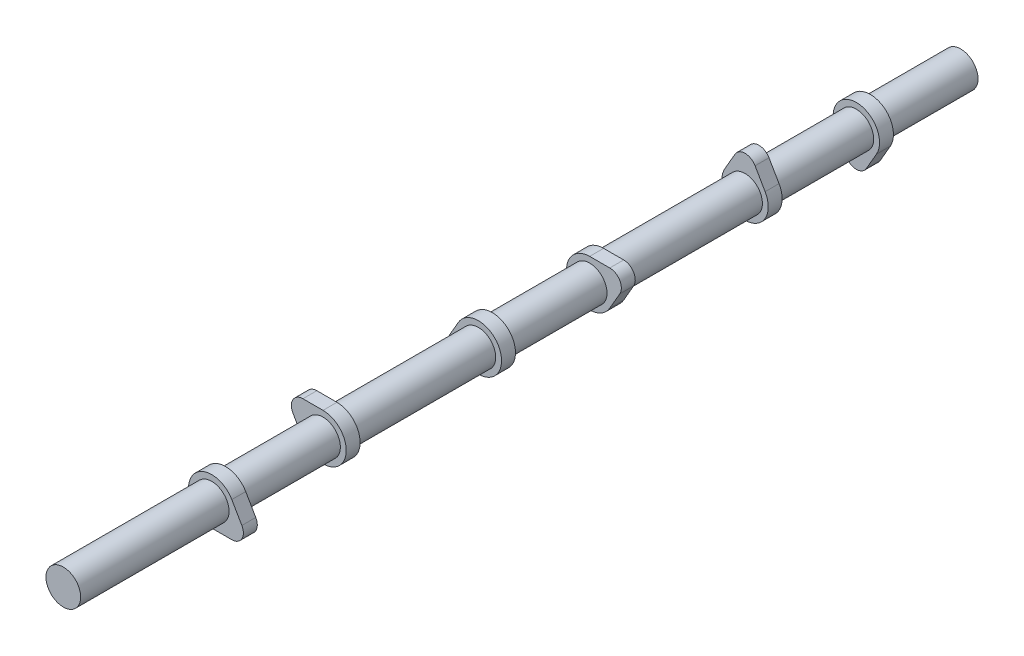
ISO-10303-21;
HEADER;
FILE_DESCRIPTION(('STEP AP214'),'2;1');
FILE_NAME('part.step','',(''),(''),'','','');
FILE_SCHEMA(('AUTOMOTIVE_DESIGN { 1 0 10303 214 1 1 1 1 }'));
ENDSEC;
DATA;
#1=APPLICATION_CONTEXT('core data for automotive mechanical design processes');
#2=APPLICATION_PROTOCOL_DEFINITION('international standard','automotive_design',2000,#1);
#3=PRODUCT_CONTEXT('',#1,'mechanical');
#4=PRODUCT('Part','Part','',(#3));
#5=PRODUCT_RELATED_PRODUCT_CATEGORY('part','',(#4));
#6=PRODUCT_DEFINITION_FORMATION('','',#4);
#7=PRODUCT_DEFINITION_CONTEXT('part definition',#1,'design');
#8=PRODUCT_DEFINITION('design','',#6,#7);
#9=PRODUCT_DEFINITION_SHAPE('','',#8);
#10=(LENGTH_UNIT() NAMED_UNIT(*) SI_UNIT(.MILLI.,.METRE.));
#11=(NAMED_UNIT(*) PLANE_ANGLE_UNIT() SI_UNIT($,.RADIAN.));
#12=(NAMED_UNIT(*) SI_UNIT($,.STERADIAN.) SOLID_ANGLE_UNIT());
#13=UNCERTAINTY_MEASURE_WITH_UNIT(LENGTH_MEASURE(1.E-05),#10,'distance_accuracy_value','');
#14=(GEOMETRIC_REPRESENTATION_CONTEXT(3) GLOBAL_UNCERTAINTY_ASSIGNED_CONTEXT((#13)) GLOBAL_UNIT_ASSIGNED_CONTEXT((#10,
#11,#12)) REPRESENTATION_CONTEXT('',''));
#15=CARTESIAN_POINT('',(0.,0.,0.));
#16=DIRECTION('',(0.,0.,1.));
#17=DIRECTION('',(1.,0.,0.));
#18=AXIS2_PLACEMENT_3D('',#15,#16,#17);
#19=CARTESIAN_POINT('',(0.,12.7,64.77));
#20=DIRECTION('',(0.,0.,-1.));
#21=DIRECTION('',(-1.,0.,0.));
#22=AXIS2_PLACEMENT_3D('',#19,#20,#21);
#23=CYLINDRICAL_SURFACE('',#22,6.35);
#24=CARTESIAN_POINT('',(0.,12.7,57.15));
#25=DIRECTION('',(0.,0.,1.));
#26=DIRECTION('',(1.,0.,0.));
#27=AXIS2_PLACEMENT_3D('',#24,#25,#26);
#28=CIRCLE('',#27,6.35);
#29=CARTESIAN_POINT('',(5.49926131403118,15.875,57.15));
#30=VERTEX_POINT('',#29);
#31=CARTESIAN_POINT('',(-5.49926131403118,15.875,57.15));
#32=VERTEX_POINT('',#31);
#33=EDGE_CURVE('E456',#30,#32,#28,.T.);
#34=ORIENTED_EDGE('',*,*,#33,.T.);
#35=DIRECTION('',(0.,0.,-1.));
#36=VECTOR('',#35,1.);
#37=CARTESIAN_POINT('',(-5.49926131403118,15.875,64.77));
#38=LINE('',#37,#36);
#39=CARTESIAN_POINT('',(-5.49926131403118,15.875,64.77));
#40=VERTEX_POINT('',#39);
#41=EDGE_CURVE('E486',#40,#32,#38,.T.);
#42=ORIENTED_EDGE('',*,*,#41,.F.);
#43=CARTESIAN_POINT('',(0.,12.7,64.77));
#44=DIRECTION('',(0.,0.,1.));
#45=DIRECTION('',(1.,0.,0.));
#46=AXIS2_PLACEMENT_3D('',#43,#44,#45);
#47=CIRCLE('',#46,6.35);
#48=CARTESIAN_POINT('',(5.49926131403118,15.875,64.77));
#49=VERTEX_POINT('',#48);
#50=EDGE_CURVE('E457',#49,#40,#47,.T.);
#51=ORIENTED_EDGE('',*,*,#50,.F.);
#52=DIRECTION('',(0.,0.,-1.));
#53=VECTOR('',#52,1.);
#54=CARTESIAN_POINT('',(5.49926131403118,15.875,64.77));
#55=LINE('',#54,#53);
#56=EDGE_CURVE('E467',#49,#30,#55,.T.);
#57=ORIENTED_EDGE('',*,*,#56,.T.);
#58=EDGE_LOOP('',(#34,#42,#51,#57));
#59=FACE_BOUND('',#58,.T.);
#60=ADVANCED_FACE('F41',(#59),#23,.T.);
#61=CARTESIAN_POINT('',(-5.49926131403118,15.875,64.77));
#62=DIRECTION('',(0.866025403784439,-0.5,0.));
#63=DIRECTION('',(0.5,0.866025403784439,0.));
#64=AXIS2_PLACEMENT_3D('',#61,#62,#63);
#65=PLANE('',#64);
#66=DIRECTION('',(-0.5,-0.866025403784439,0.));
#67=VECTOR('',#66,1.);
#68=CARTESIAN_POINT('',(-5.49926131403118,15.875,57.15));
#69=LINE('',#68,#67);
#70=CARTESIAN_POINT('',(-10.9985226280624,6.35,57.15));
#71=VERTEX_POINT('',#70);
#72=EDGE_CURVE('E471',#32,#71,#69,.T.);
#73=ORIENTED_EDGE('',*,*,#72,.T.);
#74=DIRECTION('',(0.,0.,-1.));
#75=VECTOR('',#74,1.);
#76=CARTESIAN_POINT('',(-10.9985226280624,6.35,64.77));
#77=LINE('',#76,#75);
#78=CARTESIAN_POINT('',(-10.9985226280624,6.35,64.77));
#79=VERTEX_POINT('',#78);
#80=EDGE_CURVE('E483',#79,#71,#77,.T.);
#81=ORIENTED_EDGE('',*,*,#80,.F.);
#82=DIRECTION('',(-0.5,-0.866025403784439,0.));
#83=VECTOR('',#82,1.);
#84=CARTESIAN_POINT('',(-5.49926131403118,15.875,64.77));
#85=LINE('',#84,#83);
#86=EDGE_CURVE('E91',#40,#79,#85,.T.);
#87=ORIENTED_EDGE('',*,*,#86,.F.);
#88=ORIENTED_EDGE('',*,*,#41,.T.);
#89=EDGE_LOOP('',(#73,#81,#87,#88));
#90=FACE_BOUND('',#89,.T.);
#91=ADVANCED_FACE('F507',(#90),#65,.F.);
#92=CARTESIAN_POINT('',(0.,0.,64.77));
#93=DIRECTION('',(0.,0.,-1.));
#94=DIRECTION('',(-1.,0.,0.));
#95=AXIS2_PLACEMENT_3D('',#92,#93,#94);
#96=CYLINDRICAL_SURFACE('',#95,12.7);
#97=CARTESIAN_POINT('',(0.,0.,57.15));
#98=DIRECTION('',(0.,0.,1.));
#99=DIRECTION('',(1.,0.,0.));
#100=AXIS2_PLACEMENT_3D('',#97,#98,#99);
#101=CIRCLE('',#100,12.7);
#102=CARTESIAN_POINT('',(10.9985226280624,6.35,57.15));
#103=VERTEX_POINT('',#102);
#104=EDGE_CURVE('E77',#71,#103,#101,.T.);
#105=ORIENTED_EDGE('',*,*,#104,.T.);
#106=DIRECTION('',(0.,0.,-1.));
#107=VECTOR('',#106,1.);
#108=CARTESIAN_POINT('',(10.9985226280624,6.35,64.77));
#109=LINE('',#108,#107);
#110=CARTESIAN_POINT('',(10.9985226280624,6.35,64.77));
#111=VERTEX_POINT('',#110);
#112=EDGE_CURVE('E480',#111,#103,#109,.T.);
#113=ORIENTED_EDGE('',*,*,#112,.F.);
#114=CARTESIAN_POINT('',(0.,0.,64.77));
#115=DIRECTION('',(0.,0.,1.));
#116=DIRECTION('',(1.,0.,0.));
#117=AXIS2_PLACEMENT_3D('',#114,#115,#116);
#118=CIRCLE('',#117,12.7);
#119=EDGE_CURVE('E462',#79,#111,#118,.T.);
#120=ORIENTED_EDGE('',*,*,#119,.F.);
#121=ORIENTED_EDGE('',*,*,#80,.T.);
#122=EDGE_LOOP('',(#105,#113,#120,#121));
#123=FACE_BOUND('',#122,.T.);
#124=ADVANCED_FACE('F506',(#123),#96,.T.);
#125=CARTESIAN_POINT('',(5.49926131403118,15.875,64.77));
#126=DIRECTION('',(-0.866025403784438,-0.5,0.));
#127=DIRECTION('',(0.5,-0.866025403784439,0.));
#128=AXIS2_PLACEMENT_3D('',#125,#126,#127);
#129=PLANE('',#128);
#130=DIRECTION('',(-0.5,0.866025403784439,0.));
#131=VECTOR('',#130,1.);
#132=CARTESIAN_POINT('',(5.49926131403118,15.875,57.15));
#133=LINE('',#132,#131);
#134=EDGE_CURVE('E83',#103,#30,#133,.T.);
#135=ORIENTED_EDGE('',*,*,#134,.T.);
#136=ORIENTED_EDGE('',*,*,#56,.F.);
#137=DIRECTION('',(-0.5,0.866025403784439,0.));
#138=VECTOR('',#137,1.);
#139=CARTESIAN_POINT('',(5.49926131403118,15.875,64.77));
#140=LINE('',#139,#138);
#141=EDGE_CURVE('E59',#111,#49,#140,.T.);
#142=ORIENTED_EDGE('',*,*,#141,.F.);
#143=ORIENTED_EDGE('',*,*,#112,.T.);
#144=EDGE_LOOP('',(#135,#136,#142,#143));
#145=FACE_BOUND('',#144,.T.);
#146=ADVANCED_FACE('F504',(#145),#129,.F.);
#147=CARTESIAN_POINT('',(0.,12.7,64.77));
#148=DIRECTION('',(0.,0.,1.));
#149=DIRECTION('',(1.,0.,0.));
#150=AXIS2_PLACEMENT_3D('',#147,#148,#149);
#151=PLANE('',#150);
#152=CARTESIAN_POINT('',(0.,0.,64.77));
#153=DIRECTION('',(0.,0.,1.));
#154=DIRECTION('',(1.,0.,0.));
#155=AXIS2_PLACEMENT_3D('',#152,#153,#154);
#156=CIRCLE('',#155,9.5);
#157=CARTESIAN_POINT('',(9.5,0.,64.77));
#158=VERTEX_POINT('',#157);
#159=EDGE_CURVE('E452',#158,#158,#156,.F.);
#160=ORIENTED_EDGE('',*,*,#159,.T.);
#161=EDGE_LOOP('',(#160));
#162=FACE_BOUND('',#161,.T.);
#163=ORIENTED_EDGE('',*,*,#50,.T.);
#164=ORIENTED_EDGE('',*,*,#86,.T.);
#165=ORIENTED_EDGE('',*,*,#119,.T.);
#166=ORIENTED_EDGE('',*,*,#141,.T.);
#167=EDGE_LOOP('',(#163,#164,#165,#166));
#168=FACE_BOUND('',#167,.T.);
#169=ADVANCED_FACE('F498',(#162,#168),#151,.T.);
#170=CARTESIAN_POINT('',(0.,12.7,57.15));
#171=DIRECTION('',(0.,0.,1.));
#172=DIRECTION('',(1.,0.,0.));
#173=AXIS2_PLACEMENT_3D('',#170,#171,#172);
#174=PLANE('',#173);
#175=CARTESIAN_POINT('',(0.,0.,57.15));
#176=DIRECTION('',(0.,0.,1.));
#177=DIRECTION('',(1.,0.,0.));
#178=AXIS2_PLACEMENT_3D('',#175,#176,#177);
#179=CIRCLE('',#178,9.5);
#180=CARTESIAN_POINT('',(9.5,0.,57.15));
#181=VERTEX_POINT('',#180);
#182=EDGE_CURVE('E51',#181,#181,#179,.F.);
#183=ORIENTED_EDGE('',*,*,#182,.F.);
#184=EDGE_LOOP('',(#183));
#185=FACE_BOUND('',#184,.T.);
#186=ORIENTED_EDGE('',*,*,#33,.F.);
#187=ORIENTED_EDGE('',*,*,#134,.F.);
#188=ORIENTED_EDGE('',*,*,#104,.F.);
#189=ORIENTED_EDGE('',*,*,#72,.F.);
#190=EDGE_LOOP('',(#186,#187,#188,#189));
#191=FACE_BOUND('',#190,.T.);
#192=ADVANCED_FACE('F495',(#185,#191),#174,.F.);
#193=CARTESIAN_POINT('',(0.,0.,120.65));
#194=DIRECTION('',(0.,0.,-1.));
#195=DIRECTION('',(-1.,0.,0.));
#196=AXIS2_PLACEMENT_3D('',#193,#194,#195);
#197=CYLINDRICAL_SURFACE('',#196,9.5);
#198=CARTESIAN_POINT('',(0.,0.,3.80999999999999));
#199=DIRECTION('',(0.,0.,1.));
#200=DIRECTION('',(1.,0.,0.));
#201=AXIS2_PLACEMENT_3D('',#198,#199,#200);
#202=CIRCLE('',#201,9.5);
#203=CARTESIAN_POINT('',(9.5,0.,3.80999999999999));
#204=VERTEX_POINT('',#203);
#205=EDGE_CURVE('E44',#204,#204,#202,.T.);
#206=ORIENTED_EDGE('',*,*,#205,.T.);
#207=EDGE_LOOP('',(#206));
#208=FACE_BOUND('',#207,.T.);
#209=ORIENTED_EDGE('',*,*,#182,.T.);
#210=EDGE_LOOP('',(#209));
#211=FACE_BOUND('',#210,.T.);
#212=ADVANCED_FACE('F493',(#208,#211),#197,.T.);
#213=ORIENTED_EDGE('',*,*,#159,.F.);
#214=EDGE_LOOP('',(#213));
#215=FACE_BOUND('',#214,.T.);
#216=CARTESIAN_POINT('',(0.,0.,142.24));
#217=DIRECTION('',(0.,0.,1.));
#218=DIRECTION('',(-0.500000000000004,0.866025403784436,0.));
#219=AXIS2_PLACEMENT_3D('',#216,#217,#218);
#220=CIRCLE('',#219,9.5);
#221=CARTESIAN_POINT('',(-4.75000000000004,8.22724133595215,142.24));
#222=VERTEX_POINT('',#221);
#223=EDGE_CURVE('E399',#222,#222,#220,.T.);
#224=ORIENTED_EDGE('',*,*,#223,.F.);
#225=EDGE_LOOP('',(#224));
#226=FACE_BOUND('',#225,.T.);
#227=ADVANCED_FACE('F520',(#215,#226),#197,.T.);
#228=CARTESIAN_POINT('',(0.,-12.7,3.81));
#229=DIRECTION('',(0.,0.,-1.));
#230=DIRECTION('',(1.,0.,0.));
#231=AXIS2_PLACEMENT_3D('',#228,#229,#230);
#232=CYLINDRICAL_SURFACE('',#231,6.35);
#233=CARTESIAN_POINT('',(0.,-12.7,-3.81));
#234=DIRECTION('',(0.,0.,1.));
#235=DIRECTION('',(-1.,0.,0.));
#236=AXIS2_PLACEMENT_3D('',#233,#234,#235);
#237=CIRCLE('',#236,6.35);
#238=CARTESIAN_POINT('',(-5.49926131403129,-15.875,-3.81));
#239=VERTEX_POINT('',#238);
#240=CARTESIAN_POINT('',(5.49926131403107,-15.875,-3.81));
#241=VERTEX_POINT('',#240);
#242=EDGE_CURVE('E410',#239,#241,#237,.T.);
#243=ORIENTED_EDGE('',*,*,#242,.T.);
#244=DIRECTION('',(0.,0.,-1.));
#245=VECTOR('',#244,1.);
#246=CARTESIAN_POINT('',(5.49926131403107,-15.875,3.81));
#247=LINE('',#246,#245);
#248=CARTESIAN_POINT('',(5.49926131403107,-15.875,3.81));
#249=VERTEX_POINT('',#248);
#250=EDGE_CURVE('E448',#249,#241,#247,.T.);
#251=ORIENTED_EDGE('',*,*,#250,.F.);
#252=CARTESIAN_POINT('',(0.,-12.7,3.81));
#253=DIRECTION('',(0.,0.,1.));
#254=DIRECTION('',(-1.,0.,0.));
#255=AXIS2_PLACEMENT_3D('',#252,#253,#254);
#256=CIRCLE('',#255,6.35);
#257=CARTESIAN_POINT('',(-5.49926131403129,-15.875,3.81));
#258=VERTEX_POINT('',#257);
#259=EDGE_CURVE('E411',#258,#249,#256,.T.);
#260=ORIENTED_EDGE('',*,*,#259,.F.);
#261=DIRECTION('',(0.,0.,-1.));
#262=VECTOR('',#261,1.);
#263=CARTESIAN_POINT('',(-5.49926131403129,-15.875,3.81));
#264=LINE('',#263,#262);
#265=EDGE_CURVE('E425',#258,#239,#264,.T.);
#266=ORIENTED_EDGE('',*,*,#265,.T.);
#267=EDGE_LOOP('',(#243,#251,#260,#266));
#268=FACE_BOUND('',#267,.T.);
#269=ADVANCED_FACE('F523',(#268),#232,.T.);
#270=CARTESIAN_POINT('',(5.49926131403107,-15.875,3.81));
#271=DIRECTION('',(-0.866025403784435,0.500000000000006,0.));
#272=DIRECTION('',(-0.500000000000006,-0.866025403784435,0.));
#273=AXIS2_PLACEMENT_3D('',#270,#271,#272);
#274=PLANE('',#273);
#275=DIRECTION('',(0.500000000000006,0.866025403784435,0.));
#276=VECTOR('',#275,1.);
#277=CARTESIAN_POINT('',(5.49926131403107,-15.875,-3.81));
#278=LINE('',#277,#276);
#279=CARTESIAN_POINT('',(10.9985226280623,-6.35000000000008,-3.81));
#280=VERTEX_POINT('',#279);
#281=EDGE_CURVE('E429',#241,#280,#278,.T.);
#282=ORIENTED_EDGE('',*,*,#281,.T.);
#283=DIRECTION('',(0.,0.,-1.));
#284=VECTOR('',#283,1.);
#285=CARTESIAN_POINT('',(10.9985226280623,-6.35000000000008,3.81));
#286=LINE('',#285,#284);
#287=CARTESIAN_POINT('',(10.9985226280623,-6.35000000000008,3.81));
#288=VERTEX_POINT('',#287);
#289=EDGE_CURVE('E444',#288,#280,#286,.T.);
#290=ORIENTED_EDGE('',*,*,#289,.F.);
#291=DIRECTION('',(0.500000000000006,0.866025403784435,0.));
#292=VECTOR('',#291,1.);
#293=CARTESIAN_POINT('',(5.49926131403107,-15.875,3.81));
#294=LINE('',#293,#292);
#295=EDGE_CURVE('E415',#249,#288,#294,.T.);
#296=ORIENTED_EDGE('',*,*,#295,.F.);
#297=ORIENTED_EDGE('',*,*,#250,.T.);
#298=EDGE_LOOP('',(#282,#290,#296,#297));
#299=FACE_BOUND('',#298,.T.);
#300=ADVANCED_FACE('F528',(#299),#274,.F.);
#301=CARTESIAN_POINT('',(0.,0.,3.81));
#302=DIRECTION('',(0.,0.,-1.));
#303=DIRECTION('',(1.,0.,0.));
#304=AXIS2_PLACEMENT_3D('',#301,#302,#303);
#305=CYLINDRICAL_SURFACE('',#304,12.7);
#306=CARTESIAN_POINT('',(0.,0.,-3.81));
#307=DIRECTION('',(0.,0.,1.));
#308=DIRECTION('',(-1.,0.,0.));
#309=AXIS2_PLACEMENT_3D('',#306,#307,#308);
#310=CIRCLE('',#309,12.7);
#311=CARTESIAN_POINT('',(-10.9985226280624,-6.34999999999993,-3.81));
#312=VERTEX_POINT('',#311);
#313=EDGE_CURVE('E432',#280,#312,#310,.T.);
#314=ORIENTED_EDGE('',*,*,#313,.T.);
#315=DIRECTION('',(0.,0.,-1.));
#316=VECTOR('',#315,1.);
#317=CARTESIAN_POINT('',(-10.9985226280624,-6.34999999999993,3.81));
#318=LINE('',#317,#316);
#319=CARTESIAN_POINT('',(-10.9985226280624,-6.34999999999993,3.81));
#320=VERTEX_POINT('',#319);
#321=EDGE_CURVE('E440',#320,#312,#318,.T.);
#322=ORIENTED_EDGE('',*,*,#321,.F.);
#323=CARTESIAN_POINT('',(0.,0.,3.81));
#324=DIRECTION('',(0.,0.,1.));
#325=DIRECTION('',(-1.,0.,0.));
#326=AXIS2_PLACEMENT_3D('',#323,#324,#325);
#327=CIRCLE('',#326,12.7);
#328=EDGE_CURVE('E419',#288,#320,#327,.T.);
#329=ORIENTED_EDGE('',*,*,#328,.F.);
#330=ORIENTED_EDGE('',*,*,#289,.T.);
#331=EDGE_LOOP('',(#314,#322,#329,#330));
#332=FACE_BOUND('',#331,.T.);
#333=ADVANCED_FACE('F532',(#332),#305,.T.);
#334=CARTESIAN_POINT('',(-5.49926131403129,-15.875,3.81));
#335=DIRECTION('',(0.866025403784442,0.499999999999994,0.));
#336=DIRECTION('',(-0.499999999999994,0.866025403784442,0.));
#337=AXIS2_PLACEMENT_3D('',#334,#335,#336);
#338=PLANE('',#337);
#339=DIRECTION('',(0.499999999999994,-0.866025403784442,0.));
#340=VECTOR('',#339,1.);
#341=CARTESIAN_POINT('',(-5.49926131403129,-15.875,-3.81));
#342=LINE('',#341,#340);
#343=EDGE_CURVE('E416',#312,#239,#342,.T.);
#344=ORIENTED_EDGE('',*,*,#343,.T.);
#345=ORIENTED_EDGE('',*,*,#265,.F.);
#346=DIRECTION('',(0.499999999999994,-0.866025403784442,0.));
#347=VECTOR('',#346,1.);
#348=CARTESIAN_POINT('',(-5.49926131403129,-15.875,3.81));
#349=LINE('',#348,#347);
#350=EDGE_CURVE('E422',#320,#258,#349,.T.);
#351=ORIENTED_EDGE('',*,*,#350,.F.);
#352=ORIENTED_EDGE('',*,*,#321,.T.);
#353=EDGE_LOOP('',(#344,#345,#351,#352));
#354=FACE_BOUND('',#353,.T.);
#355=ADVANCED_FACE('F536',(#354),#338,.F.);
#356=CARTESIAN_POINT('',(0.,-12.7,3.81));
#357=DIRECTION('',(0.,0.,1.));
#358=DIRECTION('',(-1.,0.,0.));
#359=AXIS2_PLACEMENT_3D('',#356,#357,#358);
#360=PLANE('',#359);
#361=ORIENTED_EDGE('',*,*,#205,.F.);
#362=EDGE_LOOP('',(#361));
#363=FACE_BOUND('',#362,.T.);
#364=ORIENTED_EDGE('',*,*,#259,.T.);
#365=ORIENTED_EDGE('',*,*,#295,.T.);
#366=ORIENTED_EDGE('',*,*,#328,.T.);
#367=ORIENTED_EDGE('',*,*,#350,.T.);
#368=EDGE_LOOP('',(#364,#365,#366,#367));
#369=FACE_BOUND('',#368,.T.);
#370=ADVANCED_FACE('F540',(#363,#369),#360,.T.);
#371=CARTESIAN_POINT('',(0.,-12.7,-3.81));
#372=DIRECTION('',(0.,0.,1.));
#373=DIRECTION('',(-1.,0.,0.));
#374=AXIS2_PLACEMENT_3D('',#371,#372,#373);
#375=PLANE('',#374);
#376=CARTESIAN_POINT('',(0.,0.,-3.80999999999999));
#377=DIRECTION('',(0.,0.,1.));
#378=DIRECTION('',(1.,0.,0.));
#379=AXIS2_PLACEMENT_3D('',#376,#377,#378);
#380=CIRCLE('',#379,9.5);
#381=CARTESIAN_POINT('',(9.5,0.,-3.80999999999999));
#382=VERTEX_POINT('',#381);
#383=EDGE_CURVE('E11',#382,#382,#380,.T.);
#384=ORIENTED_EDGE('',*,*,#383,.T.);
#385=EDGE_LOOP('',(#384));
#386=FACE_BOUND('',#385,.T.);
#387=ORIENTED_EDGE('',*,*,#242,.F.);
#388=ORIENTED_EDGE('',*,*,#343,.F.);
#389=ORIENTED_EDGE('',*,*,#313,.F.);
#390=ORIENTED_EDGE('',*,*,#281,.F.);
#391=EDGE_LOOP('',(#387,#388,#389,#390));
#392=FACE_BOUND('',#391,.T.);
#393=ADVANCED_FACE('F542',(#386,#392),#375,.F.);
#394=ORIENTED_EDGE('',*,*,#383,.F.);
#395=EDGE_LOOP('',(#394));
#396=FACE_BOUND('',#395,.T.);
#397=CARTESIAN_POINT('',(0.,0.,-53.34));
#398=DIRECTION('',(0.,0.,-1.));
#399=DIRECTION('',(-1.,0.,0.));
#400=AXIS2_PLACEMENT_3D('',#397,#398,#399);
#401=CIRCLE('',#400,9.5);
#402=CARTESIAN_POINT('',(-9.5,0.,-53.34));
#403=VERTEX_POINT('',#402);
#404=EDGE_CURVE('E403',#403,#403,#401,.T.);
#405=ORIENTED_EDGE('',*,*,#404,.F.);
#406=EDGE_LOOP('',(#405));
#407=FACE_BOUND('',#406,.T.);
#408=ADVANCED_FACE('F525',(#396,#407),#197,.T.);
#409=CARTESIAN_POINT('',(0.,0.,-53.34));
#410=DIRECTION('',(0.,0.,-1.));
#411=DIRECTION('',(-1.,0.,0.));
#412=AXIS2_PLACEMENT_3D('',#409,#410,#411);
#413=PLANE('',#412);
#414=ORIENTED_EDGE('',*,*,#404,.T.);
#415=EDGE_LOOP('',(#414));
#416=FACE_BOUND('',#415,.T.);
#417=ADVANCED_FACE('F549',(#416),#413,.T.);
#418=CARTESIAN_POINT('',(-10.9985226280623,-6.35000000000005,210.82));
#419=DIRECTION('',(0.,0.,-1.));
#420=DIRECTION('',(0.500000000000004,-0.866025403784436,0.));
#421=AXIS2_PLACEMENT_3D('',#418,#419,#420);
#422=CYLINDRICAL_SURFACE('',#421,6.35);
#423=CARTESIAN_POINT('',(-10.9985226280623,-6.35000000000005,203.2));
#424=DIRECTION('',(0.,0.,1.));
#425=DIRECTION('',(-0.500000000000004,0.866025403784436,0.));
#426=AXIS2_PLACEMENT_3D('',#423,#424,#425);
#427=CIRCLE('',#426,6.35);
#428=CARTESIAN_POINT('',(-16.4977839420935,-3.17500000000008,203.2));
#429=VERTEX_POINT('',#428);
#430=CARTESIAN_POINT('',(-10.9985226280623,-12.7000000000001,203.2));
#431=VERTEX_POINT('',#430);
#432=EDGE_CURVE('E353',#429,#431,#427,.T.);
#433=ORIENTED_EDGE('',*,*,#432,.T.);
#434=DIRECTION('',(0.,0.,-1.));
#435=VECTOR('',#434,1.);
#436=CARTESIAN_POINT('',(-10.9985226280623,-12.7000000000001,210.82));
#437=LINE('',#436,#435);
#438=CARTESIAN_POINT('',(-10.9985226280623,-12.7000000000001,210.82));
#439=VERTEX_POINT('',#438);
#440=EDGE_CURVE('E391',#439,#431,#437,.T.);
#441=ORIENTED_EDGE('',*,*,#440,.F.);
#442=CARTESIAN_POINT('',(-10.9985226280623,-6.35000000000005,210.82));
#443=DIRECTION('',(0.,0.,1.));
#444=DIRECTION('',(-0.500000000000004,0.866025403784436,0.));
#445=AXIS2_PLACEMENT_3D('',#442,#443,#444);
#446=CIRCLE('',#445,6.35);
#447=CARTESIAN_POINT('',(-16.4977839420935,-3.17500000000008,210.82));
#448=VERTEX_POINT('',#447);
#449=EDGE_CURVE('E354',#448,#439,#446,.T.);
#450=ORIENTED_EDGE('',*,*,#449,.F.);
#451=DIRECTION('',(0.,0.,-1.));
#452=VECTOR('',#451,1.);
#453=CARTESIAN_POINT('',(-16.4977839420935,-3.17500000000008,210.82));
#454=LINE('',#453,#452);
#455=EDGE_CURVE('E368',#448,#429,#454,.T.);
#456=ORIENTED_EDGE('',*,*,#455,.T.);
#457=EDGE_LOOP('',(#433,#441,#450,#456));
#458=FACE_BOUND('',#457,.T.);
#459=ADVANCED_FACE('F552',(#458),#422,.T.);
#460=CARTESIAN_POINT('',(-10.9985226280623,-12.7000000000001,210.82));
#461=DIRECTION('',(0.,1.,0.));
#462=DIRECTION('',(-1.,0.,0.));
#463=AXIS2_PLACEMENT_3D('',#460,#461,#462);
#464=PLANE('',#463);
#465=DIRECTION('',(1.,0.,0.));
#466=VECTOR('',#465,1.);
#467=CARTESIAN_POINT('',(-10.9985226280623,-12.7000000000001,203.2));
#468=LINE('',#467,#466);
#469=CARTESIAN_POINT('',(0.,-12.7,203.2));
#470=VERTEX_POINT('',#469);
#471=EDGE_CURVE('E372',#431,#470,#468,.T.);
#472=ORIENTED_EDGE('',*,*,#471,.T.);
#473=DIRECTION('',(0.,0.,-1.));
#474=VECTOR('',#473,1.);
#475=CARTESIAN_POINT('',(0.,-12.7,210.82));
#476=LINE('',#475,#474);
#477=CARTESIAN_POINT('',(0.,-12.7,210.82));
#478=VERTEX_POINT('',#477);
#479=EDGE_CURVE('E387',#478,#470,#476,.T.);
#480=ORIENTED_EDGE('',*,*,#479,.F.);
#481=DIRECTION('',(1.,0.,0.));
#482=VECTOR('',#481,1.);
#483=CARTESIAN_POINT('',(-10.9985226280623,-12.7000000000001,210.82));
#484=LINE('',#483,#482);
#485=EDGE_CURVE('E358',#439,#478,#484,.T.);
#486=ORIENTED_EDGE('',*,*,#485,.F.);
#487=ORIENTED_EDGE('',*,*,#440,.T.);
#488=EDGE_LOOP('',(#472,#480,#486,#487));
#489=FACE_BOUND('',#488,.T.);
#490=ADVANCED_FACE('F556',(#489),#464,.F.);
#491=CARTESIAN_POINT('',(0.,0.,210.82));
#492=DIRECTION('',(0.,0.,-1.));
#493=DIRECTION('',(0.500000000000004,-0.866025403784436,0.));
#494=AXIS2_PLACEMENT_3D('',#491,#492,#493);
#495=CYLINDRICAL_SURFACE('',#494,12.7);
#496=CARTESIAN_POINT('',(0.,0.,203.2));
#497=DIRECTION('',(0.,0.,1.));
#498=DIRECTION('',(-0.500000000000004,0.866025403784436,0.));
#499=AXIS2_PLACEMENT_3D('',#496,#497,#498);
#500=CIRCLE('',#499,12.7);
#501=CARTESIAN_POINT('',(-10.9985226280624,6.34999999999995,203.2));
#502=VERTEX_POINT('',#501);
#503=EDGE_CURVE('E375',#470,#502,#500,.T.);
#504=ORIENTED_EDGE('',*,*,#503,.T.);
#505=DIRECTION('',(0.,0.,-1.));
#506=VECTOR('',#505,1.);
#507=CARTESIAN_POINT('',(-10.9985226280624,6.34999999999995,210.82));
#508=LINE('',#507,#506);
#509=CARTESIAN_POINT('',(-10.9985226280624,6.34999999999995,210.82));
#510=VERTEX_POINT('',#509);
#511=EDGE_CURVE('E383',#510,#502,#508,.T.);
#512=ORIENTED_EDGE('',*,*,#511,.F.);
#513=CARTESIAN_POINT('',(0.,0.,210.82));
#514=DIRECTION('',(0.,0.,1.));
#515=DIRECTION('',(-0.500000000000004,0.866025403784436,0.));
#516=AXIS2_PLACEMENT_3D('',#513,#514,#515);
#517=CIRCLE('',#516,12.7);
#518=EDGE_CURVE('E362',#478,#510,#517,.T.);
#519=ORIENTED_EDGE('',*,*,#518,.F.);
#520=ORIENTED_EDGE('',*,*,#479,.T.);
#521=EDGE_LOOP('',(#504,#512,#519,#520));
#522=FACE_BOUND('',#521,.T.);
#523=ADVANCED_FACE('F560',(#522),#495,.T.);
#524=CARTESIAN_POINT('',(-16.4977839420935,-3.17500000000008,210.82));
#525=DIRECTION('',(0.866025403784441,-0.499999999999996,0.));
#526=DIRECTION('',(0.499999999999996,0.866025403784441,0.));
#527=AXIS2_PLACEMENT_3D('',#524,#525,#526);
#528=PLANE('',#527);
#529=DIRECTION('',(-0.499999999999996,-0.866025403784441,0.));
#530=VECTOR('',#529,1.);
#531=CARTESIAN_POINT('',(-16.4977839420935,-3.17500000000008,203.2));
#532=LINE('',#531,#530);
#533=EDGE_CURVE('E359',#502,#429,#532,.T.);
#534=ORIENTED_EDGE('',*,*,#533,.T.);
#535=ORIENTED_EDGE('',*,*,#455,.F.);
#536=DIRECTION('',(-0.499999999999996,-0.866025403784441,0.));
#537=VECTOR('',#536,1.);
#538=CARTESIAN_POINT('',(-16.4977839420935,-3.17500000000008,210.82));
#539=LINE('',#538,#537);
#540=EDGE_CURVE('E365',#510,#448,#539,.T.);
#541=ORIENTED_EDGE('',*,*,#540,.F.);
#542=ORIENTED_EDGE('',*,*,#511,.T.);
#543=EDGE_LOOP('',(#534,#535,#541,#542));
#544=FACE_BOUND('',#543,.T.);
#545=ADVANCED_FACE('F564',(#544),#528,.F.);
#546=CARTESIAN_POINT('',(-10.9985226280623,-6.35000000000005,210.82));
#547=DIRECTION('',(0.,0.,1.));
#548=DIRECTION('',(-0.500000000000004,0.866025403784436,0.));
#549=AXIS2_PLACEMENT_3D('',#546,#547,#548);
#550=PLANE('',#549);
#551=CARTESIAN_POINT('',(0.,0.,210.82));
#552=DIRECTION('',(0.,0.,1.));
#553=DIRECTION('',(-0.500000000000004,0.866025403784436,0.));
#554=AXIS2_PLACEMENT_3D('',#551,#552,#553);
#555=CIRCLE('',#554,9.5);
#556=CARTESIAN_POINT('',(-4.75000000000004,8.22724133595215,210.82));
#557=VERTEX_POINT('',#556);
#558=EDGE_CURVE('E349',#557,#557,#555,.F.);
#559=ORIENTED_EDGE('',*,*,#558,.T.);
#560=EDGE_LOOP('',(#559));
#561=FACE_BOUND('',#560,.T.);
#562=ORIENTED_EDGE('',*,*,#449,.T.);
#563=ORIENTED_EDGE('',*,*,#485,.T.);
#564=ORIENTED_EDGE('',*,*,#518,.T.);
#565=ORIENTED_EDGE('',*,*,#540,.T.);
#566=EDGE_LOOP('',(#562,#563,#564,#565));
#567=FACE_BOUND('',#566,.T.);
#568=ADVANCED_FACE('F568',(#561,#567),#550,.T.);
#569=CARTESIAN_POINT('',(-10.9985226280623,-6.35000000000005,203.2));
#570=DIRECTION('',(0.,0.,1.));
#571=DIRECTION('',(-0.500000000000004,0.866025403784436,0.));
#572=AXIS2_PLACEMENT_3D('',#569,#570,#571);
#573=PLANE('',#572);
#574=CARTESIAN_POINT('',(0.,0.,203.2));
#575=DIRECTION('',(0.,0.,1.));
#576=DIRECTION('',(-0.500000000000004,0.866025403784436,0.));
#577=AXIS2_PLACEMENT_3D('',#574,#575,#576);
#578=CIRCLE('',#577,9.5);
#579=CARTESIAN_POINT('',(-4.75000000000004,8.22724133595215,203.2));
#580=VERTEX_POINT('',#579);
#581=EDGE_CURVE('E395',#580,#580,#578,.F.);
#582=ORIENTED_EDGE('',*,*,#581,.F.);
#583=EDGE_LOOP('',(#582));
#584=FACE_BOUND('',#583,.T.);
#585=ORIENTED_EDGE('',*,*,#432,.F.);
#586=ORIENTED_EDGE('',*,*,#533,.F.);
#587=ORIENTED_EDGE('',*,*,#503,.F.);
#588=ORIENTED_EDGE('',*,*,#471,.F.);
#589=EDGE_LOOP('',(#585,#586,#587,#588));
#590=FACE_BOUND('',#589,.T.);
#591=ADVANCED_FACE('F570',(#584,#590),#573,.F.);
#592=CARTESIAN_POINT('',(0.,0.,266.7));
#593=DIRECTION('',(0.,0.,-1.));
#594=DIRECTION('',(0.500000000000004,-0.866025403784436,0.));
#595=AXIS2_PLACEMENT_3D('',#592,#593,#594);
#596=CYLINDRICAL_SURFACE('',#595,9.5);
#597=CARTESIAN_POINT('',(0.,0.,149.86));
#598=DIRECTION('',(0.,0.,1.));
#599=DIRECTION('',(-0.500000000000004,0.866025403784436,0.));
#600=AXIS2_PLACEMENT_3D('',#597,#598,#599);
#601=CIRCLE('',#600,9.5);
#602=CARTESIAN_POINT('',(-4.75000000000004,8.22724133595215,149.86));
#603=VERTEX_POINT('',#602);
#604=EDGE_CURVE('E348',#603,#603,#601,.T.);
#605=ORIENTED_EDGE('',*,*,#604,.T.);
#606=EDGE_LOOP('',(#605));
#607=FACE_BOUND('',#606,.T.);
#608=ORIENTED_EDGE('',*,*,#581,.T.);
#609=EDGE_LOOP('',(#608));
#610=FACE_BOUND('',#609,.T.);
#611=ADVANCED_FACE('F573',(#607,#610),#596,.T.);
#612=ORIENTED_EDGE('',*,*,#558,.F.);
#613=EDGE_LOOP('',(#612));
#614=FACE_BOUND('',#613,.T.);
#615=CARTESIAN_POINT('',(0.,0.,288.29));
#616=DIRECTION('',(0.,0.,1.));
#617=DIRECTION('',(-0.499999999999992,-0.866025403784443,0.));
#618=AXIS2_PLACEMENT_3D('',#615,#616,#617);
#619=CIRCLE('',#618,9.5);
#620=CARTESIAN_POINT('',(-4.74999999999992,-8.22724133595221,288.29));
#621=VERTEX_POINT('',#620);
#622=EDGE_CURVE('E302',#621,#621,#619,.T.);
#623=ORIENTED_EDGE('',*,*,#622,.F.);
#624=EDGE_LOOP('',(#623));
#625=FACE_BOUND('',#624,.T.);
#626=ADVANCED_FACE('F578',(#614,#625),#596,.T.);
#627=CARTESIAN_POINT('',(10.9985226280624,6.34999999999997,149.86));
#628=DIRECTION('',(0.,0.,-1.));
#629=DIRECTION('',(-0.499999999999998,0.86602540378444,0.));
#630=AXIS2_PLACEMENT_3D('',#627,#628,#629);
#631=CYLINDRICAL_SURFACE('',#630,6.35);
#632=CARTESIAN_POINT('',(10.9985226280624,6.34999999999997,142.24));
#633=DIRECTION('',(0.,0.,1.));
#634=DIRECTION('',(0.499999999999998,-0.86602540378444,0.));
#635=AXIS2_PLACEMENT_3D('',#632,#633,#634);
#636=CIRCLE('',#635,6.35);
#637=CARTESIAN_POINT('',(16.4977839420936,3.17499999999996,142.24));
#638=VERTEX_POINT('',#637);
#639=CARTESIAN_POINT('',(10.9985226280624,12.7,142.24));
#640=VERTEX_POINT('',#639);
#641=EDGE_CURVE('E305',#638,#640,#636,.T.);
#642=ORIENTED_EDGE('',*,*,#641,.T.);
#643=DIRECTION('',(0.,0.,-1.));
#644=VECTOR('',#643,1.);
#645=CARTESIAN_POINT('',(10.9985226280624,12.7,149.86));
#646=LINE('',#645,#644);
#647=CARTESIAN_POINT('',(10.9985226280624,12.7,149.86));
#648=VERTEX_POINT('',#647);
#649=EDGE_CURVE('E344',#648,#640,#646,.T.);
#650=ORIENTED_EDGE('',*,*,#649,.F.);
#651=CARTESIAN_POINT('',(10.9985226280624,6.34999999999997,149.86));
#652=DIRECTION('',(0.,0.,1.));
#653=DIRECTION('',(0.499999999999998,-0.86602540378444,0.));
#654=AXIS2_PLACEMENT_3D('',#651,#652,#653);
#655=CIRCLE('',#654,6.35);
#656=CARTESIAN_POINT('',(16.4977839420936,3.17499999999996,149.86));
#657=VERTEX_POINT('',#656);
#658=EDGE_CURVE('E307',#657,#648,#655,.T.);
#659=ORIENTED_EDGE('',*,*,#658,.F.);
#660=DIRECTION('',(0.,0.,-1.));
#661=VECTOR('',#660,1.);
#662=CARTESIAN_POINT('',(16.4977839420936,3.17499999999996,149.86));
#663=LINE('',#662,#661);
#664=EDGE_CURVE('E321',#657,#638,#663,.T.);
#665=ORIENTED_EDGE('',*,*,#664,.T.);
#666=EDGE_LOOP('',(#642,#650,#659,#665));
#667=FACE_BOUND('',#666,.T.);
#668=ADVANCED_FACE('F581',(#667),#631,.T.);
#669=CARTESIAN_POINT('',(10.9985226280624,12.7,149.86));
#670=DIRECTION('',(0.,-1.,0.));
#671=DIRECTION('',(1.,0.,0.));
#672=AXIS2_PLACEMENT_3D('',#669,#670,#671);
#673=PLANE('',#672);
#674=DIRECTION('',(-1.,0.,0.));
#675=VECTOR('',#674,1.);
#676=CARTESIAN_POINT('',(10.9985226280624,12.7,142.24));
#677=LINE('',#676,#675);
#678=CARTESIAN_POINT('',(0.,12.7,142.24));
#679=VERTEX_POINT('',#678);
#680=EDGE_CURVE('E325',#640,#679,#677,.T.);
#681=ORIENTED_EDGE('',*,*,#680,.T.);
#682=DIRECTION('',(0.,0.,-1.));
#683=VECTOR('',#682,1.);
#684=CARTESIAN_POINT('',(0.,12.7,149.86));
#685=LINE('',#684,#683);
#686=CARTESIAN_POINT('',(0.,12.7,149.86));
#687=VERTEX_POINT('',#686);
#688=EDGE_CURVE('E340',#687,#679,#685,.T.);
#689=ORIENTED_EDGE('',*,*,#688,.F.);
#690=DIRECTION('',(-1.,0.,0.));
#691=VECTOR('',#690,1.);
#692=CARTESIAN_POINT('',(10.9985226280624,12.7,149.86));
#693=LINE('',#692,#691);
#694=EDGE_CURVE('E311',#648,#687,#693,.T.);
#695=ORIENTED_EDGE('',*,*,#694,.F.);
#696=ORIENTED_EDGE('',*,*,#649,.T.);
#697=EDGE_LOOP('',(#681,#689,#695,#696));
#698=FACE_BOUND('',#697,.T.);
#699=ADVANCED_FACE('F585',(#698),#673,.F.);
#700=CARTESIAN_POINT('',(0.,0.,149.86));
#701=DIRECTION('',(0.,0.,-1.));
#702=DIRECTION('',(-0.499999999999998,0.86602540378444,0.));
#703=AXIS2_PLACEMENT_3D('',#700,#701,#702);
#704=CYLINDRICAL_SURFACE('',#703,12.7);
#705=CARTESIAN_POINT('',(0.,0.,142.24));
#706=DIRECTION('',(0.,0.,1.));
#707=DIRECTION('',(0.499999999999998,-0.86602540378444,0.));
#708=AXIS2_PLACEMENT_3D('',#705,#706,#707);
#709=CIRCLE('',#708,12.7);
#710=CARTESIAN_POINT('',(10.9985226280624,-6.35000000000003,142.24));
#711=VERTEX_POINT('',#710);
#712=EDGE_CURVE('E328',#679,#711,#709,.T.);
#713=ORIENTED_EDGE('',*,*,#712,.T.);
#714=DIRECTION('',(0.,0.,-1.));
#715=VECTOR('',#714,1.);
#716=CARTESIAN_POINT('',(10.9985226280624,-6.35000000000003,149.86));
#717=LINE('',#716,#715);
#718=CARTESIAN_POINT('',(10.9985226280624,-6.35000000000003,149.86));
#719=VERTEX_POINT('',#718);
#720=EDGE_CURVE('E336',#719,#711,#717,.T.);
#721=ORIENTED_EDGE('',*,*,#720,.F.);
#722=CARTESIAN_POINT('',(0.,0.,149.86));
#723=DIRECTION('',(0.,0.,1.));
#724=DIRECTION('',(0.499999999999998,-0.86602540378444,0.));
#725=AXIS2_PLACEMENT_3D('',#722,#723,#724);
#726=CIRCLE('',#725,12.7);
#727=EDGE_CURVE('E315',#687,#719,#726,.T.);
#728=ORIENTED_EDGE('',*,*,#727,.F.);
#729=ORIENTED_EDGE('',*,*,#688,.T.);
#730=EDGE_LOOP('',(#713,#721,#728,#729));
#731=FACE_BOUND('',#730,.T.);
#732=ADVANCED_FACE('F589',(#731),#704,.T.);
#733=CARTESIAN_POINT('',(16.4977839420936,3.17499999999996,149.86));
#734=DIRECTION('',(-0.866025403784438,0.500000000000002,0.));
#735=DIRECTION('',(-0.500000000000002,-0.866025403784438,0.));
#736=AXIS2_PLACEMENT_3D('',#733,#734,#735);
#737=PLANE('',#736);
#738=DIRECTION('',(0.500000000000002,0.866025403784438,0.));
#739=VECTOR('',#738,1.);
#740=CARTESIAN_POINT('',(16.4977839420936,3.17499999999996,142.24));
#741=LINE('',#740,#739);
#742=EDGE_CURVE('E312',#711,#638,#741,.T.);
#743=ORIENTED_EDGE('',*,*,#742,.T.);
#744=ORIENTED_EDGE('',*,*,#664,.F.);
#745=DIRECTION('',(0.500000000000002,0.866025403784438,0.));
#746=VECTOR('',#745,1.);
#747=CARTESIAN_POINT('',(16.4977839420936,3.17499999999996,149.86));
#748=LINE('',#747,#746);
#749=EDGE_CURVE('E318',#719,#657,#748,.T.);
#750=ORIENTED_EDGE('',*,*,#749,.F.);
#751=ORIENTED_EDGE('',*,*,#720,.T.);
#752=EDGE_LOOP('',(#743,#744,#750,#751));
#753=FACE_BOUND('',#752,.T.);
#754=ADVANCED_FACE('F593',(#753),#737,.F.);
#755=CARTESIAN_POINT('',(10.9985226280624,6.34999999999997,149.86));
#756=DIRECTION('',(0.,0.,1.));
#757=DIRECTION('',(0.499999999999998,-0.86602540378444,0.));
#758=AXIS2_PLACEMENT_3D('',#755,#756,#757);
#759=PLANE('',#758);
#760=ORIENTED_EDGE('',*,*,#604,.F.);
#761=EDGE_LOOP('',(#760));
#762=FACE_BOUND('',#761,.T.);
#763=ORIENTED_EDGE('',*,*,#658,.T.);
#764=ORIENTED_EDGE('',*,*,#694,.T.);
#765=ORIENTED_EDGE('',*,*,#727,.T.);
#766=ORIENTED_EDGE('',*,*,#749,.T.);
#767=EDGE_LOOP('',(#763,#764,#765,#766));
#768=FACE_BOUND('',#767,.T.);
#769=ADVANCED_FACE('F597',(#762,#768),#759,.T.);
#770=CARTESIAN_POINT('',(10.9985226280624,6.34999999999997,142.24));
#771=DIRECTION('',(0.,0.,1.));
#772=DIRECTION('',(0.499999999999998,-0.86602540378444,0.));
#773=AXIS2_PLACEMENT_3D('',#770,#771,#772);
#774=PLANE('',#773);
#775=ORIENTED_EDGE('',*,*,#223,.T.);
#776=EDGE_LOOP('',(#775));
#777=FACE_BOUND('',#776,.T.);
#778=ORIENTED_EDGE('',*,*,#641,.F.);
#779=ORIENTED_EDGE('',*,*,#742,.F.);
#780=ORIENTED_EDGE('',*,*,#712,.F.);
#781=ORIENTED_EDGE('',*,*,#680,.F.);
#782=EDGE_LOOP('',(#778,#779,#780,#781));
#783=FACE_BOUND('',#782,.T.);
#784=ADVANCED_FACE('F599',(#777,#783),#774,.F.);
#785=CARTESIAN_POINT('',(10.9985226280624,-6.3499999999999,356.87));
#786=DIRECTION('',(0.,0.,-1.));
#787=DIRECTION('',(0.499999999999992,0.866025403784443,0.));
#788=AXIS2_PLACEMENT_3D('',#785,#786,#787);
#789=CYLINDRICAL_SURFACE('',#788,6.35);
#790=CARTESIAN_POINT('',(10.9985226280624,-6.3499999999999,349.25));
#791=DIRECTION('',(0.,0.,1.));
#792=DIRECTION('',(-0.499999999999992,-0.866025403784443,0.));
#793=AXIS2_PLACEMENT_3D('',#790,#791,#792);
#794=CIRCLE('',#793,6.35);
#795=CARTESIAN_POINT('',(10.9985226280625,-12.6999999999999,349.25));
#796=VERTEX_POINT('',#795);
#797=CARTESIAN_POINT('',(16.4977839420936,-3.17499999999985,349.25));
#798=VERTEX_POINT('',#797);
#799=EDGE_CURVE('E256',#796,#798,#794,.T.);
#800=ORIENTED_EDGE('',*,*,#799,.T.);
#801=DIRECTION('',(0.,0.,-1.));
#802=VECTOR('',#801,1.);
#803=CARTESIAN_POINT('',(16.4977839420936,-3.17499999999985,356.87));
#804=LINE('',#803,#802);
#805=CARTESIAN_POINT('',(16.4977839420936,-3.17499999999985,356.87));
#806=VERTEX_POINT('',#805);
#807=EDGE_CURVE('E294',#806,#798,#804,.T.);
#808=ORIENTED_EDGE('',*,*,#807,.F.);
#809=CARTESIAN_POINT('',(10.9985226280624,-6.3499999999999,356.87));
#810=DIRECTION('',(0.,0.,1.));
#811=DIRECTION('',(-0.499999999999992,-0.866025403784443,0.));
#812=AXIS2_PLACEMENT_3D('',#809,#810,#811);
#813=CIRCLE('',#812,6.35);
#814=CARTESIAN_POINT('',(10.9985226280625,-12.6999999999999,356.87));
#815=VERTEX_POINT('',#814);
#816=EDGE_CURVE('E257',#815,#806,#813,.T.);
#817=ORIENTED_EDGE('',*,*,#816,.F.);
#818=DIRECTION('',(0.,0.,-1.));
#819=VECTOR('',#818,1.);
#820=CARTESIAN_POINT('',(10.9985226280625,-12.6999999999999,356.87));
#821=LINE('',#820,#819);
#822=EDGE_CURVE('E271',#815,#796,#821,.T.);
#823=ORIENTED_EDGE('',*,*,#822,.T.);
#824=EDGE_LOOP('',(#800,#808,#817,#823));
#825=FACE_BOUND('',#824,.T.);
#826=ADVANCED_FACE('F602',(#825),#789,.T.);
#827=CARTESIAN_POINT('',(16.4977839420936,-3.17499999999985,356.87));
#828=DIRECTION('',(-0.866025403784434,-0.500000000000008,0.));
#829=DIRECTION('',(0.500000000000008,-0.866025403784434,0.));
#830=AXIS2_PLACEMENT_3D('',#827,#828,#829);
#831=PLANE('',#830);
#832=DIRECTION('',(-0.500000000000008,0.866025403784434,0.));
#833=VECTOR('',#832,1.);
#834=CARTESIAN_POINT('',(16.4977839420936,-3.17499999999985,349.25));
#835=LINE('',#834,#833);
#836=CARTESIAN_POINT('',(10.9985226280623,6.3500000000001,349.25));
#837=VERTEX_POINT('',#836);
#838=EDGE_CURVE('E275',#798,#837,#835,.T.);
#839=ORIENTED_EDGE('',*,*,#838,.T.);
#840=DIRECTION('',(0.,0.,-1.));
#841=VECTOR('',#840,1.);
#842=CARTESIAN_POINT('',(10.9985226280623,6.3500000000001,356.87));
#843=LINE('',#842,#841);
#844=CARTESIAN_POINT('',(10.9985226280623,6.3500000000001,356.87));
#845=VERTEX_POINT('',#844);
#846=EDGE_CURVE('E290',#845,#837,#843,.T.);
#847=ORIENTED_EDGE('',*,*,#846,.F.);
#848=DIRECTION('',(-0.500000000000008,0.866025403784434,0.));
#849=VECTOR('',#848,1.);
#850=CARTESIAN_POINT('',(16.4977839420936,-3.17499999999985,356.87));
#851=LINE('',#850,#849);
#852=EDGE_CURVE('E261',#806,#845,#851,.T.);
#853=ORIENTED_EDGE('',*,*,#852,.F.);
#854=ORIENTED_EDGE('',*,*,#807,.T.);
#855=EDGE_LOOP('',(#839,#847,#853,#854));
#856=FACE_BOUND('',#855,.T.);
#857=ADVANCED_FACE('F609',(#856),#831,.F.);
#858=CARTESIAN_POINT('',(0.,0.,356.87));
#859=DIRECTION('',(0.,0.,-1.));
#860=DIRECTION('',(0.499999999999992,0.866025403784443,0.));
#861=AXIS2_PLACEMENT_3D('',#858,#859,#860);
#862=CYLINDRICAL_SURFACE('',#861,12.7);
#863=CARTESIAN_POINT('',(0.,0.,349.25));
#864=DIRECTION('',(0.,0.,1.));
#865=DIRECTION('',(-0.499999999999992,-0.866025403784443,0.));
#866=AXIS2_PLACEMENT_3D('',#863,#864,#865);
#867=CIRCLE('',#866,12.7);
#868=CARTESIAN_POINT('',(1.20563281580388E-13,-12.7,349.25));
#869=VERTEX_POINT('',#868);
#870=EDGE_CURVE('E278',#837,#869,#867,.T.);
#871=ORIENTED_EDGE('',*,*,#870,.T.);
#872=DIRECTION('',(0.,0.,-1.));
#873=VECTOR('',#872,1.);
#874=CARTESIAN_POINT('',(1.20563281580388E-13,-12.7,356.87));
#875=LINE('',#874,#873);
#876=CARTESIAN_POINT('',(1.20563281580388E-13,-12.7,356.87));
#877=VERTEX_POINT('',#876);
#878=EDGE_CURVE('E286',#877,#869,#875,.T.);
#879=ORIENTED_EDGE('',*,*,#878,.F.);
#880=CARTESIAN_POINT('',(0.,0.,356.87));
#881=DIRECTION('',(0.,0.,1.));
#882=DIRECTION('',(-0.499999999999992,-0.866025403784443,0.));
#883=AXIS2_PLACEMENT_3D('',#880,#881,#882);
#884=CIRCLE('',#883,12.7);
#885=EDGE_CURVE('E265',#845,#877,#884,.T.);
#886=ORIENTED_EDGE('',*,*,#885,.F.);
#887=ORIENTED_EDGE('',*,*,#846,.T.);
#888=EDGE_LOOP('',(#871,#879,#886,#887));
#889=FACE_BOUND('',#888,.T.);
#890=ADVANCED_FACE('F613',(#889),#862,.T.);
#891=CARTESIAN_POINT('',(10.9985226280625,-12.6999999999999,356.87));
#892=DIRECTION('',(0.,1.,0.));
#893=DIRECTION('',(-1.,0.,0.));
#894=AXIS2_PLACEMENT_3D('',#891,#892,#893);
#895=PLANE('',#894);
#896=DIRECTION('',(1.,0.,0.));
#897=VECTOR('',#896,1.);
#898=CARTESIAN_POINT('',(10.9985226280625,-12.6999999999999,349.25));
#899=LINE('',#898,#897);
#900=EDGE_CURVE('E262',#869,#796,#899,.T.);
#901=ORIENTED_EDGE('',*,*,#900,.T.);
#902=ORIENTED_EDGE('',*,*,#822,.F.);
#903=DIRECTION('',(1.,0.,0.));
#904=VECTOR('',#903,1.);
#905=CARTESIAN_POINT('',(10.9985226280625,-12.6999999999999,356.87));
#906=LINE('',#905,#904);
#907=EDGE_CURVE('E268',#877,#815,#906,.T.);
#908=ORIENTED_EDGE('',*,*,#907,.F.);
#909=ORIENTED_EDGE('',*,*,#878,.T.);
#910=EDGE_LOOP('',(#901,#902,#908,#909));
#911=FACE_BOUND('',#910,.T.);
#912=ADVANCED_FACE('F617',(#911),#895,.F.);
#913=CARTESIAN_POINT('',(10.9985226280624,-6.3499999999999,356.87));
#914=DIRECTION('',(0.,0.,1.));
#915=DIRECTION('',(-0.499999999999992,-0.866025403784443,0.));
#916=AXIS2_PLACEMENT_3D('',#913,#914,#915);
#917=PLANE('',#916);
#918=CARTESIAN_POINT('',(0.,0.,356.87));
#919=DIRECTION('',(0.,0.,1.));
#920=DIRECTION('',(-0.499999999999992,-0.866025403784443,0.));
#921=AXIS2_PLACEMENT_3D('',#918,#919,#920);
#922=CIRCLE('',#921,9.5);
#923=CARTESIAN_POINT('',(-4.74999999999992,-8.22724133595221,356.87));
#924=VERTEX_POINT('',#923);
#925=EDGE_CURVE('E247',#924,#924,#922,.F.);
#926=ORIENTED_EDGE('',*,*,#925,.T.);
#927=EDGE_LOOP('',(#926));
#928=FACE_BOUND('',#927,.T.);
#929=ORIENTED_EDGE('',*,*,#816,.T.);
#930=ORIENTED_EDGE('',*,*,#852,.T.);
#931=ORIENTED_EDGE('',*,*,#885,.T.);
#932=ORIENTED_EDGE('',*,*,#907,.T.);
#933=EDGE_LOOP('',(#929,#930,#931,#932));
#934=FACE_BOUND('',#933,.T.);
#935=ADVANCED_FACE('F621',(#928,#934),#917,.T.);
#936=CARTESIAN_POINT('',(10.9985226280624,-6.3499999999999,349.25));
#937=DIRECTION('',(0.,0.,1.));
#938=DIRECTION('',(-0.499999999999992,-0.866025403784443,0.));
#939=AXIS2_PLACEMENT_3D('',#936,#937,#938);
#940=PLANE('',#939);
#941=CARTESIAN_POINT('',(0.,0.,349.25));
#942=DIRECTION('',(0.,0.,1.));
#943=DIRECTION('',(-0.499999999999992,-0.866025403784443,0.));
#944=AXIS2_PLACEMENT_3D('',#941,#942,#943);
#945=CIRCLE('',#944,9.5);
#946=CARTESIAN_POINT('',(-4.74999999999992,-8.22724133595221,349.25));
#947=VERTEX_POINT('',#946);
#948=EDGE_CURVE('E298',#947,#947,#945,.F.);
#949=ORIENTED_EDGE('',*,*,#948,.F.);
#950=EDGE_LOOP('',(#949));
#951=FACE_BOUND('',#950,.T.);
#952=ORIENTED_EDGE('',*,*,#799,.F.);
#953=ORIENTED_EDGE('',*,*,#900,.F.);
#954=ORIENTED_EDGE('',*,*,#870,.F.);
#955=ORIENTED_EDGE('',*,*,#838,.F.);
#956=EDGE_LOOP('',(#952,#953,#954,#955));
#957=FACE_BOUND('',#956,.T.);
#958=ADVANCED_FACE('F623',(#951,#957),#940,.F.);
#959=CARTESIAN_POINT('',(0.,0.,412.75));
#960=DIRECTION('',(0.,0.,-1.));
#961=DIRECTION('',(0.499999999999992,0.866025403784443,0.));
#962=AXIS2_PLACEMENT_3D('',#959,#960,#961);
#963=CYLINDRICAL_SURFACE('',#962,9.5);
#964=CARTESIAN_POINT('',(0.,0.,295.91));
#965=DIRECTION('',(0.,0.,1.));
#966=DIRECTION('',(-0.499999999999992,-0.866025403784443,0.));
#967=AXIS2_PLACEMENT_3D('',#964,#965,#966);
#968=CIRCLE('',#967,9.5);
#969=CARTESIAN_POINT('',(-4.74999999999992,-8.22724133595221,295.91));
#970=VERTEX_POINT('',#969);
#971=EDGE_CURVE('E242',#970,#970,#968,.T.);
#972=ORIENTED_EDGE('',*,*,#971,.T.);
#973=EDGE_LOOP('',(#972));
#974=FACE_BOUND('',#973,.T.);
#975=ORIENTED_EDGE('',*,*,#948,.T.);
#976=EDGE_LOOP('',(#975));
#977=FACE_BOUND('',#976,.T.);
#978=ADVANCED_FACE('F626',(#974,#977),#963,.T.);
#979=ORIENTED_EDGE('',*,*,#925,.F.);
#980=EDGE_LOOP('',(#979));
#981=FACE_BOUND('',#980,.T.);
#982=CARTESIAN_POINT('',(0.,0.,438.15));
#983=DIRECTION('',(0.,0.,1.));
#984=DIRECTION('',(1.,0.,0.));
#985=AXIS2_PLACEMENT_3D('',#982,#983,#984);
#986=CIRCLE('',#985,9.5);
#987=CARTESIAN_POINT('',(9.5,0.,438.15));
#988=VERTEX_POINT('',#987);
#989=EDGE_CURVE('E661',#988,#988,#986,.T.);
#990=ORIENTED_EDGE('',*,*,#989,.F.);
#991=EDGE_LOOP('',(#990));
#992=FACE_BOUND('',#991,.T.);
#993=ADVANCED_FACE('F631',(#981,#992),#963,.T.);
#994=CARTESIAN_POINT('',(-10.9985226280624,6.34999999999997,295.91));
#995=DIRECTION('',(0.,0.,-1.));
#996=DIRECTION('',(-0.499999999999998,-0.86602540378444,0.));
#997=AXIS2_PLACEMENT_3D('',#994,#995,#996);
#998=CYLINDRICAL_SURFACE('',#997,6.35);
#999=CARTESIAN_POINT('',(-10.9985226280624,6.34999999999997,288.29));
#1000=DIRECTION('',(0.,0.,1.));
#1001=DIRECTION('',(0.499999999999998,0.86602540378444,0.));
#1002=AXIS2_PLACEMENT_3D('',#999,#1000,#1001);
#1003=CIRCLE('',#1002,6.35);
#1004=CARTESIAN_POINT('',(-10.9985226280624,12.7,288.29));
#1005=VERTEX_POINT('',#1004);
#1006=CARTESIAN_POINT('',(-16.4977839420936,3.17499999999996,288.29));
#1007=VERTEX_POINT('',#1006);
#1008=EDGE_CURVE('E240',#1005,#1007,#1003,.T.);
#1009=ORIENTED_EDGE('',*,*,#1008,.T.);
#1010=DIRECTION('',(0.,0.,-1.));
#1011=VECTOR('',#1010,1.);
#1012=CARTESIAN_POINT('',(-16.4977839420936,3.17499999999996,295.91));
#1013=LINE('',#1012,#1011);
#1014=CARTESIAN_POINT('',(-16.4977839420936,3.17499999999996,295.91));
#1015=VERTEX_POINT('',#1014);
#1016=EDGE_CURVE('E218',#1015,#1007,#1013,.T.);
#1017=ORIENTED_EDGE('',*,*,#1016,.F.);
#1018=CARTESIAN_POINT('',(-10.9985226280624,6.34999999999997,295.91));
#1019=DIRECTION('',(0.,0.,1.));
#1020=DIRECTION('',(0.499999999999998,0.86602540378444,0.));
#1021=AXIS2_PLACEMENT_3D('',#1018,#1019,#1020);
#1022=CIRCLE('',#1021,6.35);
#1023=CARTESIAN_POINT('',(-10.9985226280624,12.7,295.91));
#1024=VERTEX_POINT('',#1023);
#1025=EDGE_CURVE('E226',#1024,#1015,#1022,.T.);
#1026=ORIENTED_EDGE('',*,*,#1025,.F.);
#1027=DIRECTION('',(0.,0.,-1.));
#1028=VECTOR('',#1027,1.);
#1029=CARTESIAN_POINT('',(-10.9985226280624,12.7,295.91));
#1030=LINE('',#1029,#1028);
#1031=EDGE_CURVE('E672',#1024,#1005,#1030,.T.);
#1032=ORIENTED_EDGE('',*,*,#1031,.T.);
#1033=EDGE_LOOP('',(#1009,#1017,#1026,#1032));
#1034=FACE_BOUND('',#1033,.T.);
#1035=ADVANCED_FACE('F238',(#1034),#998,.T.);
#1036=CARTESIAN_POINT('',(-16.4977839420936,3.17499999999996,295.91));
#1037=DIRECTION('',(0.866025403784437,0.500000000000002,0.));
#1038=DIRECTION('',(-0.500000000000002,0.866025403784437,0.));
#1039=AXIS2_PLACEMENT_3D('',#1036,#1037,#1038);
#1040=PLANE('',#1039);
#1041=DIRECTION('',(0.500000000000002,-0.866025403784437,0.));
#1042=VECTOR('',#1041,1.);
#1043=CARTESIAN_POINT('',(-16.4977839420936,3.17499999999996,288.29));
#1044=LINE('',#1043,#1042);
#1045=CARTESIAN_POINT('',(-10.9985226280624,-6.35000000000003,288.29));
#1046=VERTEX_POINT('',#1045);
#1047=EDGE_CURVE('E666',#1007,#1046,#1044,.T.);
#1048=ORIENTED_EDGE('',*,*,#1047,.T.);
#1049=DIRECTION('',(0.,0.,-1.));
#1050=VECTOR('',#1049,1.);
#1051=CARTESIAN_POINT('',(-10.9985226280624,-6.35000000000003,295.91));
#1052=LINE('',#1051,#1050);
#1053=CARTESIAN_POINT('',(-10.9985226280624,-6.35000000000003,295.91));
#1054=VERTEX_POINT('',#1053);
#1055=EDGE_CURVE('E221',#1054,#1046,#1052,.T.);
#1056=ORIENTED_EDGE('',*,*,#1055,.F.);
#1057=DIRECTION('',(0.500000000000002,-0.866025403784437,0.));
#1058=VECTOR('',#1057,1.);
#1059=CARTESIAN_POINT('',(-16.4977839420936,3.17499999999996,295.91));
#1060=LINE('',#1059,#1058);
#1061=EDGE_CURVE('E214',#1015,#1054,#1060,.T.);
#1062=ORIENTED_EDGE('',*,*,#1061,.F.);
#1063=ORIENTED_EDGE('',*,*,#1016,.T.);
#1064=EDGE_LOOP('',(#1048,#1056,#1062,#1063));
#1065=FACE_BOUND('',#1064,.T.);
#1066=ADVANCED_FACE('F216',(#1065),#1040,.F.);
#1067=CARTESIAN_POINT('',(0.,0.,295.91));
#1068=DIRECTION('',(0.,0.,-1.));
#1069=DIRECTION('',(-0.499999999999998,-0.86602540378444,0.));
#1070=AXIS2_PLACEMENT_3D('',#1067,#1068,#1069);
#1071=CYLINDRICAL_SURFACE('',#1070,12.7);
#1072=CARTESIAN_POINT('',(0.,0.,288.29));
#1073=DIRECTION('',(0.,0.,1.));
#1074=DIRECTION('',(0.499999999999998,0.86602540378444,0.));
#1075=AXIS2_PLACEMENT_3D('',#1072,#1073,#1074);
#1076=CIRCLE('',#1075,12.7);
#1077=CARTESIAN_POINT('',(0.,12.7,288.29));
#1078=VERTEX_POINT('',#1077);
#1079=EDGE_CURVE('E676',#1046,#1078,#1076,.T.);
#1080=ORIENTED_EDGE('',*,*,#1079,.T.);
#1081=DIRECTION('',(0.,0.,-1.));
#1082=VECTOR('',#1081,1.);
#1083=CARTESIAN_POINT('',(0.,12.7,295.91));
#1084=LINE('',#1083,#1082);
#1085=CARTESIAN_POINT('',(0.,12.7,295.91));
#1086=VERTEX_POINT('',#1085);
#1087=EDGE_CURVE('E249',#1086,#1078,#1084,.T.);
#1088=ORIENTED_EDGE('',*,*,#1087,.F.);
#1089=CARTESIAN_POINT('',(0.,0.,295.91));
#1090=DIRECTION('',(0.,0.,1.));
#1091=DIRECTION('',(0.499999999999998,0.86602540378444,0.));
#1092=AXIS2_PLACEMENT_3D('',#1089,#1090,#1091);
#1093=CIRCLE('',#1092,12.7);
#1094=EDGE_CURVE('E225',#1054,#1086,#1093,.T.);
#1095=ORIENTED_EDGE('',*,*,#1094,.F.);
#1096=ORIENTED_EDGE('',*,*,#1055,.T.);
#1097=EDGE_LOOP('',(#1080,#1088,#1095,#1096));
#1098=FACE_BOUND('',#1097,.T.);
#1099=ADVANCED_FACE('F639',(#1098),#1071,.T.);
#1100=CARTESIAN_POINT('',(-10.9985226280624,12.7,295.91));
#1101=DIRECTION('',(0.,-1.,0.));
#1102=DIRECTION('',(1.,0.,0.));
#1103=AXIS2_PLACEMENT_3D('',#1100,#1101,#1102);
#1104=PLANE('',#1103);
#1105=DIRECTION('',(-1.,0.,0.));
#1106=VECTOR('',#1105,1.);
#1107=CARTESIAN_POINT('',(-10.9985226280624,12.7,288.29));
#1108=LINE('',#1107,#1106);
#1109=EDGE_CURVE('E236',#1078,#1005,#1108,.T.);
#1110=ORIENTED_EDGE('',*,*,#1109,.T.);
#1111=ORIENTED_EDGE('',*,*,#1031,.F.);
#1112=DIRECTION('',(-1.,0.,0.));
#1113=VECTOR('',#1112,1.);
#1114=CARTESIAN_POINT('',(-10.9985226280624,12.7,295.91));
#1115=LINE('',#1114,#1113);
#1116=EDGE_CURVE('E231',#1086,#1024,#1115,.T.);
#1117=ORIENTED_EDGE('',*,*,#1116,.F.);
#1118=ORIENTED_EDGE('',*,*,#1087,.T.);
#1119=EDGE_LOOP('',(#1110,#1111,#1117,#1118));
#1120=FACE_BOUND('',#1119,.T.);
#1121=ADVANCED_FACE('F642',(#1120),#1104,.F.);
#1122=CARTESIAN_POINT('',(-10.9985226280624,6.34999999999997,295.91));
#1123=DIRECTION('',(0.,0.,1.));
#1124=DIRECTION('',(0.499999999999998,0.86602540378444,0.));
#1125=AXIS2_PLACEMENT_3D('',#1122,#1123,#1124);
#1126=PLANE('',#1125);
#1127=ORIENTED_EDGE('',*,*,#971,.F.);
#1128=EDGE_LOOP('',(#1127));
#1129=FACE_BOUND('',#1128,.T.);
#1130=ORIENTED_EDGE('',*,*,#1025,.T.);
#1131=ORIENTED_EDGE('',*,*,#1061,.T.);
#1132=ORIENTED_EDGE('',*,*,#1094,.T.);
#1133=ORIENTED_EDGE('',*,*,#1116,.T.);
#1134=EDGE_LOOP('',(#1130,#1131,#1132,#1133));
#1135=FACE_BOUND('',#1134,.T.);
#1136=ADVANCED_FACE('F229',(#1129,#1135),#1126,.T.);
#1137=CARTESIAN_POINT('',(-10.9985226280624,6.34999999999997,288.29));
#1138=DIRECTION('',(0.,0.,1.));
#1139=DIRECTION('',(0.499999999999998,0.86602540378444,0.));
#1140=AXIS2_PLACEMENT_3D('',#1137,#1138,#1139);
#1141=PLANE('',#1140);
#1142=ORIENTED_EDGE('',*,*,#622,.T.);
#1143=EDGE_LOOP('',(#1142));
#1144=FACE_BOUND('',#1143,.T.);
#1145=ORIENTED_EDGE('',*,*,#1008,.F.);
#1146=ORIENTED_EDGE('',*,*,#1109,.F.);
#1147=ORIENTED_EDGE('',*,*,#1079,.F.);
#1148=ORIENTED_EDGE('',*,*,#1047,.F.);
#1149=EDGE_LOOP('',(#1145,#1146,#1147,#1148));
#1150=FACE_BOUND('',#1149,.T.);
#1151=ADVANCED_FACE('F647',(#1144,#1150),#1141,.F.);
#1152=CARTESIAN_POINT('',(0.,0.,438.15));
#1153=DIRECTION('',(0.,0.,1.));
#1154=DIRECTION('',(1.,0.,0.));
#1155=AXIS2_PLACEMENT_3D('',#1152,#1153,#1154);
#1156=PLANE('',#1155);
#1157=ORIENTED_EDGE('',*,*,#989,.T.);
#1158=EDGE_LOOP('',(#1157));
#1159=FACE_BOUND('',#1158,.T.);
#1160=ADVANCED_FACE('F650',(#1159),#1156,.T.);
#1161=CLOSED_SHELL('',(#60,#91,#124,#146,#169,#192,#212,#227,#269,#300,#333,#355,#370,#393,#408,
#417,#459,#490,#523,#545,#568,#591,#611,#626,#668,#699,#732,#754,#769,#784,#826,#857,#890,#912,
#935,#958,#978,#993,#1035,#1066,#1099,#1121,#1136,#1151,#1160));
#1162=MANIFOLD_SOLID_BREP('B2',#1161);
#1163=ADVANCED_BREP_SHAPE_REPRESENTATION('',(#18,#1162),#14);
#1164=SHAPE_DEFINITION_REPRESENTATION(#9,#1163);
ENDSEC;
END-ISO-10303-21;
